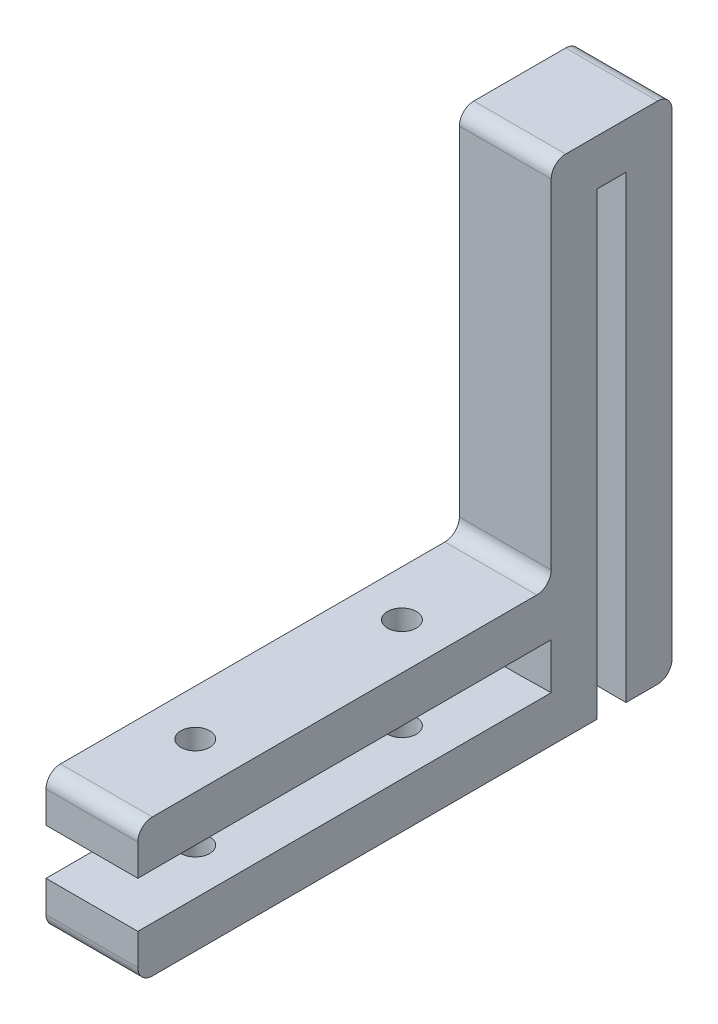
ISO-10303-21;
HEADER;
FILE_DESCRIPTION(('STEP AP214'),'2;1');
FILE_NAME('part.step','',(''),(''),'','','');
FILE_SCHEMA(('AUTOMOTIVE_DESIGN { 1 0 10303 214 1 1 1 1 }'));
ENDSEC;
DATA;
#1=APPLICATION_CONTEXT('core data for automotive mechanical design processes');
#2=APPLICATION_PROTOCOL_DEFINITION('international standard','automotive_design',2000,#1);
#3=PRODUCT_CONTEXT('',#1,'mechanical');
#4=PRODUCT('Part','Part','',(#3));
#5=PRODUCT_RELATED_PRODUCT_CATEGORY('part','',(#4));
#6=PRODUCT_DEFINITION_FORMATION('','',#4);
#7=PRODUCT_DEFINITION_CONTEXT('part definition',#1,'design');
#8=PRODUCT_DEFINITION('design','',#6,#7);
#9=PRODUCT_DEFINITION_SHAPE('','',#8);
#10=(LENGTH_UNIT() NAMED_UNIT(*) SI_UNIT(.MILLI.,.METRE.));
#11=(NAMED_UNIT(*) PLANE_ANGLE_UNIT() SI_UNIT($,.RADIAN.));
#12=(NAMED_UNIT(*) SI_UNIT($,.STERADIAN.) SOLID_ANGLE_UNIT());
#13=UNCERTAINTY_MEASURE_WITH_UNIT(LENGTH_MEASURE(1.E-05),#10,'distance_accuracy_value','');
#14=(GEOMETRIC_REPRESENTATION_CONTEXT(3) GLOBAL_UNCERTAINTY_ASSIGNED_CONTEXT((#13)) GLOBAL_UNIT_ASSIGNED_CONTEXT((#10,
#11,#12)) REPRESENTATION_CONTEXT('',''));
#15=CARTESIAN_POINT('',(0.,0.,0.));
#16=DIRECTION('',(0.,0.,1.));
#17=DIRECTION('',(1.,0.,0.));
#18=AXIS2_PLACEMENT_3D('',#15,#16,#17);
#19=CARTESIAN_POINT('',(0.,6.35,0.));
#20=DIRECTION('',(0.,-1.,0.));
#21=DIRECTION('',(0.,0.,-1.));
#22=AXIS2_PLACEMENT_3D('',#19,#20,#21);
#23=PLANE('',#22);
#24=CARTESIAN_POINT('',(6.35,6.35,-42.8625));
#25=DIRECTION('',(0.,-1.,0.));
#26=DIRECTION('',(0.,0.,-1.));
#27=AXIS2_PLACEMENT_3D('',#24,#25,#26);
#28=CIRCLE('',#27,2.);
#29=CARTESIAN_POINT('',(6.35,6.35,-44.8625));
#30=VERTEX_POINT('',#29);
#31=EDGE_CURVE('E214',#30,#30,#28,.T.);
#32=ORIENTED_EDGE('',*,*,#31,.T.);
#33=EDGE_LOOP('',(#32));
#34=FACE_BOUND('',#33,.T.);
#35=CARTESIAN_POINT('',(6.35,6.35,-14.2875));
#36=DIRECTION('',(0.,-1.,0.));
#37=DIRECTION('',(0.,0.,-1.));
#38=AXIS2_PLACEMENT_3D('',#35,#36,#37);
#39=CIRCLE('',#38,2.);
#40=CARTESIAN_POINT('',(6.35,6.35,-16.2875));
#41=VERTEX_POINT('',#40);
#42=EDGE_CURVE('E736',#41,#41,#39,.T.);
#43=ORIENTED_EDGE('',*,*,#42,.T.);
#44=EDGE_LOOP('',(#43));
#45=FACE_BOUND('',#44,.T.);
#46=CARTESIAN_POINT('',(6.35,6.35,-279.309267193606));
#47=DIRECTION('',(0.,1.,0.));
#48=DIRECTION('',(0.,0.,-1.));
#49=AXIS2_PLACEMENT_3D('',#46,#47,#48);
#50=CIRCLE('',#49,222.25);
#51=CARTESIAN_POINT('',(0.,6.35,-57.15));
#52=VERTEX_POINT('',#51);
#53=CARTESIAN_POINT('',(12.7,6.35,-57.15));
#54=VERTEX_POINT('',#53);
#55=EDGE_CURVE('E207',#52,#54,#50,.T.);
#56=ORIENTED_EDGE('',*,*,#55,.F.);
#57=DIRECTION('',(0.,0.,1.));
#58=VECTOR('',#57,1.);
#59=CARTESIAN_POINT('',(0.,6.35,0.));
#60=LINE('',#59,#58);
#61=CARTESIAN_POINT('',(0.,6.35,0.));
#62=VERTEX_POINT('',#61);
#63=EDGE_CURVE('E195',#52,#62,#60,.T.);
#64=ORIENTED_EDGE('',*,*,#63,.T.);
#65=DIRECTION('',(1.,0.,0.));
#66=VECTOR('',#65,1.);
#67=CARTESIAN_POINT('',(0.,6.35,0.));
#68=LINE('',#67,#66);
#69=CARTESIAN_POINT('',(12.7,6.35,0.));
#70=VERTEX_POINT('',#69);
#71=EDGE_CURVE('E291',#62,#70,#68,.T.);
#72=ORIENTED_EDGE('',*,*,#71,.T.);
#73=DIRECTION('',(0.,0.,-1.));
#74=VECTOR('',#73,1.);
#75=CARTESIAN_POINT('',(12.7,6.35,0.));
#76=LINE('',#75,#74);
#77=EDGE_CURVE('E295',#70,#54,#76,.T.);
#78=ORIENTED_EDGE('',*,*,#77,.T.);
#79=EDGE_LOOP('',(#56,#64,#72,#78));
#80=FACE_BOUND('',#79,.T.);
#81=ADVANCED_FACE('F38',(#34,#45,#80),#23,.F.);
#82=CARTESIAN_POINT('',(0.,12.7,0.));
#83=DIRECTION('',(0.,1.,0.));
#84=DIRECTION('',(0.,0.,1.));
#85=AXIS2_PLACEMENT_3D('',#82,#83,#84);
#86=PLANE('',#85);
#87=CARTESIAN_POINT('',(6.35,12.7,-42.8625));
#88=DIRECTION('',(0.,1.,0.));
#89=DIRECTION('',(0.,0.,1.));
#90=AXIS2_PLACEMENT_3D('',#87,#88,#89);
#91=CIRCLE('',#90,2.);
#92=CARTESIAN_POINT('',(6.35,12.7,-40.8625));
#93=VERTEX_POINT('',#92);
#94=EDGE_CURVE('E733',#93,#93,#91,.T.);
#95=ORIENTED_EDGE('',*,*,#94,.T.);
#96=EDGE_LOOP('',(#95));
#97=FACE_BOUND('',#96,.T.);
#98=CARTESIAN_POINT('',(6.35,12.7,-14.2875));
#99=DIRECTION('',(0.,1.,0.));
#100=DIRECTION('',(0.,0.,1.));
#101=AXIS2_PLACEMENT_3D('',#98,#99,#100);
#102=CIRCLE('',#101,2.);
#103=CARTESIAN_POINT('',(6.35,12.7,-12.2875));
#104=VERTEX_POINT('',#103);
#105=EDGE_CURVE('E740',#104,#104,#102,.T.);
#106=ORIENTED_EDGE('',*,*,#105,.T.);
#107=EDGE_LOOP('',(#106));
#108=FACE_BOUND('',#107,.T.);
#109=CARTESIAN_POINT('',(6.35,12.7,-279.309267193606));
#110=DIRECTION('',(0.,1.,0.));
#111=DIRECTION('',(0.,0.,-1.));
#112=AXIS2_PLACEMENT_3D('',#109,#110,#111);
#113=CIRCLE('',#112,222.25);
#114=CARTESIAN_POINT('',(0.,12.7,-57.15));
#115=VERTEX_POINT('',#114);
#116=CARTESIAN_POINT('',(12.7,12.7,-57.15));
#117=VERTEX_POINT('',#116);
#118=EDGE_CURVE('E180',#115,#117,#113,.T.);
#119=ORIENTED_EDGE('',*,*,#118,.T.);
#120=DIRECTION('',(0.,0.,-1.));
#121=VECTOR('',#120,1.);
#122=CARTESIAN_POINT('',(12.7,12.7,-63.5));
#123=LINE('',#122,#121);
#124=CARTESIAN_POINT('',(12.7,12.7,0.));
#125=VERTEX_POINT('',#124);
#126=EDGE_CURVE('E274',#125,#117,#123,.T.);
#127=ORIENTED_EDGE('',*,*,#126,.F.);
#128=DIRECTION('',(1.,0.,0.));
#129=VECTOR('',#128,1.);
#130=CARTESIAN_POINT('',(0.,12.7,0.));
#131=LINE('',#130,#129);
#132=CARTESIAN_POINT('',(0.,12.7,0.));
#133=VERTEX_POINT('',#132);
#134=EDGE_CURVE('E183',#133,#125,#131,.T.);
#135=ORIENTED_EDGE('',*,*,#134,.F.);
#136=DIRECTION('',(0.,0.,1.));
#137=VECTOR('',#136,1.);
#138=CARTESIAN_POINT('',(0.,12.7,-63.5));
#139=LINE('',#138,#137);
#140=EDGE_CURVE('E175',#115,#133,#139,.T.);
#141=ORIENTED_EDGE('',*,*,#140,.F.);
#142=EDGE_LOOP('',(#119,#127,#135,#141));
#143=FACE_BOUND('',#142,.T.);
#144=ADVANCED_FACE('F177',(#97,#108,#143),#86,.F.);
#145=CARTESIAN_POINT('',(0.,6.35,-63.5));
#146=DIRECTION('',(0.,0.,1.));
#147=DIRECTION('',(1.,0.,0.));
#148=AXIS2_PLACEMENT_3D('',#145,#146,#147);
#149=PLANE('',#148);
#150=DIRECTION('',(-1.,0.,0.));
#151=VECTOR('',#150,1.);
#152=CARTESIAN_POINT('',(12.7,63.5,-63.5));
#153=LINE('',#152,#151);
#154=CARTESIAN_POINT('',(12.7,63.5,-63.5));
#155=VERTEX_POINT('',#154);
#156=CARTESIAN_POINT('',(0.,63.5,-63.5));
#157=VERTEX_POINT('',#156);
#158=EDGE_CURVE('E240',#155,#157,#153,.T.);
#159=ORIENTED_EDGE('',*,*,#158,.F.);
#160=DIRECTION('',(0.,-1.,0.));
#161=VECTOR('',#160,1.);
#162=CARTESIAN_POINT('',(12.7,6.35,-63.5));
#163=LINE('',#162,#161);
#164=CARTESIAN_POINT('',(12.7,0.,-63.5));
#165=VERTEX_POINT('',#164);
#166=EDGE_CURVE('E309',#155,#165,#163,.T.);
#167=ORIENTED_EDGE('',*,*,#166,.T.);
#168=DIRECTION('',(-1.,0.,0.));
#169=VECTOR('',#168,1.);
#170=CARTESIAN_POINT('',(0.,0.,-63.5));
#171=LINE('',#170,#169);
#172=CARTESIAN_POINT('',(0.,0.,-63.5));
#173=VERTEX_POINT('',#172);
#174=EDGE_CURVE('E292',#165,#173,#171,.T.);
#175=ORIENTED_EDGE('',*,*,#174,.T.);
#176=DIRECTION('',(0.,-1.,0.));
#177=VECTOR('',#176,1.);
#178=CARTESIAN_POINT('',(0.,6.35,-63.5));
#179=LINE('',#178,#177);
#180=EDGE_CURVE('E298',#157,#173,#179,.T.);
#181=ORIENTED_EDGE('',*,*,#180,.F.);
#182=EDGE_LOOP('',(#159,#167,#175,#181));
#183=FACE_BOUND('',#182,.T.);
#184=ADVANCED_FACE('F438',(#183),#149,.F.);
#185=CARTESIAN_POINT('',(0.,6.35,0.));
#186=DIRECTION('',(1.,0.,0.));
#187=DIRECTION('',(0.,0.,-1.));
#188=AXIS2_PLACEMENT_3D('',#185,#186,#187);
#189=PLANE('',#188);
#190=DIRECTION('',(0.,0.,1.));
#191=VECTOR('',#190,1.);
#192=CARTESIAN_POINT('',(0.,0.,0.));
#193=LINE('',#192,#191);
#194=CARTESIAN_POINT('',(0.,0.,-2.));
#195=VERTEX_POINT('',#194);
#196=EDGE_CURVE('E199',#173,#195,#193,.T.);
#197=ORIENTED_EDGE('',*,*,#196,.T.);
#198=CARTESIAN_POINT('',(0.,2.,-2.));
#199=DIRECTION('',(1.,0.,0.));
#200=DIRECTION('',(0.,0.,-1.));
#201=AXIS2_PLACEMENT_3D('',#198,#199,#200);
#202=CIRCLE('',#201,2.);
#203=CARTESIAN_POINT('',(0.,2.,0.));
#204=VERTEX_POINT('',#203);
#205=EDGE_CURVE('E356',#195,#204,#202,.F.);
#206=ORIENTED_EDGE('',*,*,#205,.T.);
#207=DIRECTION('',(0.,-1.,0.));
#208=VECTOR('',#207,1.);
#209=CARTESIAN_POINT('',(0.,6.35,0.));
#210=LINE('',#209,#208);
#211=EDGE_CURVE('E317',#62,#204,#210,.T.);
#212=ORIENTED_EDGE('',*,*,#211,.F.);
#213=ORIENTED_EDGE('',*,*,#63,.F.);
#214=DIRECTION('',(0.,-1.,0.));
#215=VECTOR('',#214,1.);
#216=CARTESIAN_POINT('',(0.,12.7,-57.15));
#217=LINE('',#216,#215);
#218=EDGE_CURVE('E191',#115,#52,#217,.T.);
#219=ORIENTED_EDGE('',*,*,#218,.F.);
#220=ORIENTED_EDGE('',*,*,#140,.T.);
#221=DIRECTION('',(0.,-1.,0.));
#222=VECTOR('',#221,1.);
#223=CARTESIAN_POINT('',(0.,19.05,0.));
#224=LINE('',#223,#222);
#225=CARTESIAN_POINT('',(0.,17.05,0.));
#226=VERTEX_POINT('',#225);
#227=EDGE_CURVE('E284',#226,#133,#224,.T.);
#228=ORIENTED_EDGE('',*,*,#227,.F.);
#229=CARTESIAN_POINT('',(0.,17.05,-2.));
#230=DIRECTION('',(1.,0.,0.));
#231=DIRECTION('',(0.,0.,-1.));
#232=AXIS2_PLACEMENT_3D('',#229,#230,#231);
#233=CIRCLE('',#232,2.);
#234=CARTESIAN_POINT('',(0.,19.05,-2.));
#235=VERTEX_POINT('',#234);
#236=EDGE_CURVE('E352',#226,#235,#233,.F.);
#237=ORIENTED_EDGE('',*,*,#236,.T.);
#238=DIRECTION('',(0.,0.,1.));
#239=VECTOR('',#238,1.);
#240=CARTESIAN_POINT('',(0.,19.05,-63.5));
#241=LINE('',#240,#239);
#242=CARTESIAN_POINT('',(0.,19.05,-55.15));
#243=VERTEX_POINT('',#242);
#244=EDGE_CURVE('E270',#243,#235,#241,.T.);
#245=ORIENTED_EDGE('',*,*,#244,.F.);
#246=CARTESIAN_POINT('',(0.,21.05,-55.15));
#247=DIRECTION('',(1.,0.,0.));
#248=DIRECTION('',(0.,0.,-1.));
#249=AXIS2_PLACEMENT_3D('',#246,#247,#248);
#250=CIRCLE('',#249,2.);
#251=CARTESIAN_POINT('',(0.,21.05,-57.15));
#252=VERTEX_POINT('',#251);
#253=EDGE_CURVE('E11',#243,#252,#250,.T.);
#254=ORIENTED_EDGE('',*,*,#253,.T.);
#255=DIRECTION('',(0.,-1.,0.));
#256=VECTOR('',#255,1.);
#257=CARTESIAN_POINT('',(0.,69.85,-57.15));
#258=LINE('',#257,#256);
#259=CARTESIAN_POINT('',(0.,67.85,-57.15));
#260=VERTEX_POINT('',#259);
#261=EDGE_CURVE('E187',#260,#252,#258,.T.);
#262=ORIENTED_EDGE('',*,*,#261,.F.);
#263=CARTESIAN_POINT('',(0.,67.85,-59.15));
#264=DIRECTION('',(1.,0.,0.));
#265=DIRECTION('',(0.,0.,-1.));
#266=AXIS2_PLACEMENT_3D('',#263,#264,#265);
#267=CIRCLE('',#266,2.);
#268=CARTESIAN_POINT('',(0.,69.85,-59.15));
#269=VERTEX_POINT('',#268);
#270=EDGE_CURVE('E343',#260,#269,#267,.F.);
#271=ORIENTED_EDGE('',*,*,#270,.T.);
#272=DIRECTION('',(0.,0.,1.));
#273=VECTOR('',#272,1.);
#274=CARTESIAN_POINT('',(0.,69.85,-63.5));
#275=LINE('',#274,#273);
#276=CARTESIAN_POINT('',(0.,69.85,-71.85));
#277=VERTEX_POINT('',#276);
#278=EDGE_CURVE('E256',#277,#269,#275,.T.);
#279=ORIENTED_EDGE('',*,*,#278,.F.);
#280=CARTESIAN_POINT('',(0.,67.85,-71.85));
#281=DIRECTION('',(1.,0.,0.));
#282=DIRECTION('',(0.,0.,-1.));
#283=AXIS2_PLACEMENT_3D('',#280,#281,#282);
#284=CIRCLE('',#283,2.);
#285=CARTESIAN_POINT('',(0.,67.85,-73.85));
#286=VERTEX_POINT('',#285);
#287=EDGE_CURVE('E346',#277,#286,#284,.F.);
#288=ORIENTED_EDGE('',*,*,#287,.T.);
#289=DIRECTION('',(0.,1.,0.));
#290=VECTOR('',#289,1.);
#291=CARTESIAN_POINT('',(0.,69.85,-73.85));
#292=LINE('',#291,#290);
#293=CARTESIAN_POINT('',(0.,2.,-73.85));
#294=VERTEX_POINT('',#293);
#295=EDGE_CURVE('E223',#294,#286,#292,.T.);
#296=ORIENTED_EDGE('',*,*,#295,.F.);
#297=CARTESIAN_POINT('',(0.,2.,-71.85));
#298=DIRECTION('',(1.,0.,0.));
#299=DIRECTION('',(0.,0.,-1.));
#300=AXIS2_PLACEMENT_3D('',#297,#298,#299);
#301=CIRCLE('',#300,2.);
#302=CARTESIAN_POINT('',(0.,0.,-71.85));
#303=VERTEX_POINT('',#302);
#304=EDGE_CURVE('E349',#294,#303,#301,.F.);
#305=ORIENTED_EDGE('',*,*,#304,.T.);
#306=DIRECTION('',(0.,0.,1.));
#307=VECTOR('',#306,1.);
#308=CARTESIAN_POINT('',(0.,0.,-73.85));
#309=LINE('',#308,#307);
#310=CARTESIAN_POINT('',(0.,0.,-67.5));
#311=VERTEX_POINT('',#310);
#312=EDGE_CURVE('E227',#303,#311,#309,.T.);
#313=ORIENTED_EDGE('',*,*,#312,.T.);
#314=DIRECTION('',(0.,1.,0.));
#315=VECTOR('',#314,1.);
#316=CARTESIAN_POINT('',(0.,69.85,-67.5));
#317=LINE('',#316,#315);
#318=CARTESIAN_POINT('',(0.,63.5,-67.5));
#319=VERTEX_POINT('',#318);
#320=EDGE_CURVE('E224',#311,#319,#317,.T.);
#321=ORIENTED_EDGE('',*,*,#320,.T.);
#322=DIRECTION('',(0.,0.,1.));
#323=VECTOR('',#322,1.);
#324=CARTESIAN_POINT('',(0.,63.5,-67.5));
#325=LINE('',#324,#323);
#326=EDGE_CURVE('E245',#319,#157,#325,.T.);
#327=ORIENTED_EDGE('',*,*,#326,.T.);
#328=ORIENTED_EDGE('',*,*,#180,.T.);
#329=EDGE_LOOP('',(#197,#206,#212,#213,#219,#220,#228,#237,#245,#254,#262,#271,#279,#288,#296,
#305,#313,#321,#327,#328));
#330=FACE_BOUND('',#329,.T.);
#331=ADVANCED_FACE('F193',(#330),#189,.F.);
#332=CARTESIAN_POINT('',(0.,6.35,0.));
#333=DIRECTION('',(0.,0.,-1.));
#334=DIRECTION('',(-1.,0.,0.));
#335=AXIS2_PLACEMENT_3D('',#332,#333,#334);
#336=PLANE('',#335);
#337=ORIENTED_EDGE('',*,*,#211,.T.);
#338=DIRECTION('',(1.,0.,0.));
#339=VECTOR('',#338,1.);
#340=CARTESIAN_POINT('',(12.7,2.,0.));
#341=LINE('',#340,#339);
#342=CARTESIAN_POINT('',(12.7,2.,0.));
#343=VERTEX_POINT('',#342);
#344=EDGE_CURVE('E321',#204,#343,#341,.T.);
#345=ORIENTED_EDGE('',*,*,#344,.T.);
#346=DIRECTION('',(0.,-1.,0.));
#347=VECTOR('',#346,1.);
#348=CARTESIAN_POINT('',(12.7,6.35,0.));
#349=LINE('',#348,#347);
#350=EDGE_CURVE('E313',#70,#343,#349,.T.);
#351=ORIENTED_EDGE('',*,*,#350,.F.);
#352=ORIENTED_EDGE('',*,*,#71,.F.);
#353=EDGE_LOOP('',(#337,#345,#351,#352));
#354=FACE_BOUND('',#353,.T.);
#355=ADVANCED_FACE('F451',(#354),#336,.F.);
#356=CARTESIAN_POINT('',(12.7,6.35,0.));
#357=DIRECTION('',(-1.,0.,0.));
#358=DIRECTION('',(0.,0.,1.));
#359=AXIS2_PLACEMENT_3D('',#356,#357,#358);
#360=PLANE('',#359);
#361=ORIENTED_EDGE('',*,*,#350,.T.);
#362=CARTESIAN_POINT('',(12.7,2.,-2.));
#363=DIRECTION('',(-1.,0.,0.));
#364=DIRECTION('',(0.,0.,1.));
#365=AXIS2_PLACEMENT_3D('',#362,#363,#364);
#366=CIRCLE('',#365,2.);
#367=CARTESIAN_POINT('',(12.7,0.,-2.));
#368=VERTEX_POINT('',#367);
#369=EDGE_CURVE('E337',#343,#368,#366,.F.);
#370=ORIENTED_EDGE('',*,*,#369,.T.);
#371=DIRECTION('',(0.,0.,-1.));
#372=VECTOR('',#371,1.);
#373=CARTESIAN_POINT('',(12.7,0.,0.));
#374=LINE('',#373,#372);
#375=EDGE_CURVE('E301',#368,#165,#374,.T.);
#376=ORIENTED_EDGE('',*,*,#375,.T.);
#377=ORIENTED_EDGE('',*,*,#166,.F.);
#378=DIRECTION('',(0.,0.,1.));
#379=VECTOR('',#378,1.);
#380=CARTESIAN_POINT('',(12.7,63.5,-67.5));
#381=LINE('',#380,#379);
#382=CARTESIAN_POINT('',(12.7,63.5,-67.5));
#383=VERTEX_POINT('',#382);
#384=EDGE_CURVE('E252',#383,#155,#381,.T.);
#385=ORIENTED_EDGE('',*,*,#384,.F.);
#386=DIRECTION('',(0.,-1.,0.));
#387=VECTOR('',#386,1.);
#388=CARTESIAN_POINT('',(12.7,69.85,-67.5));
#389=LINE('',#388,#387);
#390=CARTESIAN_POINT('',(12.7,0.,-67.5));
#391=VERTEX_POINT('',#390);
#392=EDGE_CURVE('E206',#383,#391,#389,.T.);
#393=ORIENTED_EDGE('',*,*,#392,.T.);
#394=DIRECTION('',(0.,0.,1.));
#395=VECTOR('',#394,1.);
#396=CARTESIAN_POINT('',(12.7,0.,-73.85));
#397=LINE('',#396,#395);
#398=CARTESIAN_POINT('',(12.7,0.,-71.85));
#399=VERTEX_POINT('',#398);
#400=EDGE_CURVE('E237',#399,#391,#397,.T.);
#401=ORIENTED_EDGE('',*,*,#400,.F.);
#402=CARTESIAN_POINT('',(12.7,2.,-71.85));
#403=DIRECTION('',(-1.,0.,0.));
#404=DIRECTION('',(0.,0.,1.));
#405=AXIS2_PLACEMENT_3D('',#402,#403,#404);
#406=CIRCLE('',#405,2.);
#407=CARTESIAN_POINT('',(12.7,2.,-73.85));
#408=VERTEX_POINT('',#407);
#409=EDGE_CURVE('E331',#399,#408,#406,.F.);
#410=ORIENTED_EDGE('',*,*,#409,.T.);
#411=DIRECTION('',(0.,-1.,0.));
#412=VECTOR('',#411,1.);
#413=CARTESIAN_POINT('',(12.7,69.85,-73.85));
#414=LINE('',#413,#412);
#415=CARTESIAN_POINT('',(12.7,67.85,-73.85));
#416=VERTEX_POINT('',#415);
#417=EDGE_CURVE('E219',#416,#408,#414,.T.);
#418=ORIENTED_EDGE('',*,*,#417,.F.);
#419=CARTESIAN_POINT('',(12.7,67.85,-71.85));
#420=DIRECTION('',(-1.,0.,0.));
#421=DIRECTION('',(0.,0.,1.));
#422=AXIS2_PLACEMENT_3D('',#419,#420,#421);
#423=CIRCLE('',#422,2.);
#424=CARTESIAN_POINT('',(12.7,69.85,-71.85));
#425=VERTEX_POINT('',#424);
#426=EDGE_CURVE('E328',#416,#425,#423,.F.);
#427=ORIENTED_EDGE('',*,*,#426,.T.);
#428=DIRECTION('',(0.,0.,-1.));
#429=VECTOR('',#428,1.);
#430=CARTESIAN_POINT('',(12.7,69.85,-63.5));
#431=LINE('',#430,#429);
#432=CARTESIAN_POINT('',(12.7,69.85,-59.15));
#433=VERTEX_POINT('',#432);
#434=EDGE_CURVE('E260',#433,#425,#431,.T.);
#435=ORIENTED_EDGE('',*,*,#434,.F.);
#436=CARTESIAN_POINT('',(12.7,67.85,-59.15));
#437=DIRECTION('',(-1.,0.,0.));
#438=DIRECTION('',(0.,0.,1.));
#439=AXIS2_PLACEMENT_3D('',#436,#437,#438);
#440=CIRCLE('',#439,2.);
#441=CARTESIAN_POINT('',(12.7,67.85,-57.15));
#442=VERTEX_POINT('',#441);
#443=EDGE_CURVE('E325',#433,#442,#440,.F.);
#444=ORIENTED_EDGE('',*,*,#443,.T.);
#445=DIRECTION('',(0.,-1.,0.));
#446=VECTOR('',#445,1.);
#447=CARTESIAN_POINT('',(12.7,69.85,-57.15));
#448=LINE('',#447,#446);
#449=CARTESIAN_POINT('',(12.7,21.05,-57.15));
#450=VERTEX_POINT('',#449);
#451=EDGE_CURVE('E264',#442,#450,#448,.T.);
#452=ORIENTED_EDGE('',*,*,#451,.T.);
#453=CARTESIAN_POINT('',(12.7,21.05,-55.15));
#454=DIRECTION('',(-1.,0.,0.));
#455=DIRECTION('',(0.,0.,1.));
#456=AXIS2_PLACEMENT_3D('',#453,#454,#455);
#457=CIRCLE('',#456,2.);
#458=CARTESIAN_POINT('',(12.7,19.05,-55.15));
#459=VERTEX_POINT('',#458);
#460=EDGE_CURVE('E47',#450,#459,#457,.T.);
#461=ORIENTED_EDGE('',*,*,#460,.T.);
#462=DIRECTION('',(0.,0.,-1.));
#463=VECTOR('',#462,1.);
#464=CARTESIAN_POINT('',(12.7,19.05,-63.5));
#465=LINE('',#464,#463);
#466=CARTESIAN_POINT('',(12.7,19.05,-2.));
#467=VERTEX_POINT('',#466);
#468=EDGE_CURVE('E273',#467,#459,#465,.T.);
#469=ORIENTED_EDGE('',*,*,#468,.F.);
#470=CARTESIAN_POINT('',(12.7,17.05,-2.));
#471=DIRECTION('',(-1.,0.,0.));
#472=DIRECTION('',(0.,0.,1.));
#473=AXIS2_PLACEMENT_3D('',#470,#471,#472);
#474=CIRCLE('',#473,2.);
#475=CARTESIAN_POINT('',(12.7,17.05,0.));
#476=VERTEX_POINT('',#475);
#477=EDGE_CURVE('E334',#467,#476,#474,.F.);
#478=ORIENTED_EDGE('',*,*,#477,.T.);
#479=DIRECTION('',(0.,-1.,0.));
#480=VECTOR('',#479,1.);
#481=CARTESIAN_POINT('',(12.7,19.05,0.));
#482=LINE('',#481,#480);
#483=EDGE_CURVE('E276',#476,#125,#482,.T.);
#484=ORIENTED_EDGE('',*,*,#483,.T.);
#485=ORIENTED_EDGE('',*,*,#126,.T.);
#486=DIRECTION('',(0.,-1.,0.));
#487=VECTOR('',#486,1.);
#488=CARTESIAN_POINT('',(12.7,12.7,-57.15));
#489=LINE('',#488,#487);
#490=EDGE_CURVE('E200',#117,#54,#489,.T.);
#491=ORIENTED_EDGE('',*,*,#490,.T.);
#492=ORIENTED_EDGE('',*,*,#77,.F.);
#493=EDGE_LOOP('',(#361,#370,#376,#377,#385,#393,#401,#410,#418,#427,#435,#444,#452,#461,#469,
#478,#484,#485,#491,#492));
#494=FACE_BOUND('',#493,.T.);
#495=ADVANCED_FACE('F401',(#494),#360,.F.);
#496=CARTESIAN_POINT('',(0.,0.,0.));
#497=DIRECTION('',(0.,-1.,0.));
#498=DIRECTION('',(0.,0.,-1.));
#499=AXIS2_PLACEMENT_3D('',#496,#497,#498);
#500=PLANE('',#499);
#501=CARTESIAN_POINT('',(6.35,0.,-42.8625));
#502=DIRECTION('',(0.,1.,0.));
#503=DIRECTION('',(0.,0.,1.));
#504=AXIS2_PLACEMENT_3D('',#501,#502,#503);
#505=CIRCLE('',#504,2.);
#506=CARTESIAN_POINT('',(6.35,0.,-40.8625));
#507=VERTEX_POINT('',#506);
#508=EDGE_CURVE('E730',#507,#507,#505,.T.);
#509=ORIENTED_EDGE('',*,*,#508,.T.);
#510=EDGE_LOOP('',(#509));
#511=FACE_BOUND('',#510,.T.);
#512=CARTESIAN_POINT('',(6.35,0.,-14.2875));
#513=DIRECTION('',(0.,1.,0.));
#514=DIRECTION('',(0.,0.,-1.));
#515=AXIS2_PLACEMENT_3D('',#512,#513,#514);
#516=CIRCLE('',#515,2.);
#517=CARTESIAN_POINT('',(6.35,0.,-16.2875));
#518=VERTEX_POINT('',#517);
#519=EDGE_CURVE('E750',#518,#518,#516,.T.);
#520=ORIENTED_EDGE('',*,*,#519,.T.);
#521=EDGE_LOOP('',(#520));
#522=FACE_BOUND('',#521,.T.);
#523=ORIENTED_EDGE('',*,*,#375,.F.);
#524=DIRECTION('',(1.,0.,0.));
#525=VECTOR('',#524,1.);
#526=CARTESIAN_POINT('',(0.,0.,-2.));
#527=LINE('',#526,#525);
#528=EDGE_CURVE('E340',#368,#195,#527,.F.);
#529=ORIENTED_EDGE('',*,*,#528,.T.);
#530=ORIENTED_EDGE('',*,*,#196,.F.);
#531=ORIENTED_EDGE('',*,*,#174,.F.);
#532=EDGE_LOOP('',(#523,#529,#530,#531));
#533=FACE_BOUND('',#532,.T.);
#534=ADVANCED_FACE('F443',(#511,#522,#533),#500,.T.);
#535=CARTESIAN_POINT('',(0.,19.05,0.));
#536=DIRECTION('',(0.,0.,-1.));
#537=DIRECTION('',(-1.,0.,0.));
#538=AXIS2_PLACEMENT_3D('',#535,#536,#537);
#539=PLANE('',#538);
#540=ORIENTED_EDGE('',*,*,#483,.F.);
#541=DIRECTION('',(1.,0.,0.));
#542=VECTOR('',#541,1.);
#543=CARTESIAN_POINT('',(0.,17.05,0.));
#544=LINE('',#543,#542);
#545=EDGE_CURVE('E363',#476,#226,#544,.F.);
#546=ORIENTED_EDGE('',*,*,#545,.T.);
#547=ORIENTED_EDGE('',*,*,#227,.T.);
#548=ORIENTED_EDGE('',*,*,#134,.T.);
#549=EDGE_LOOP('',(#540,#546,#547,#548));
#550=FACE_BOUND('',#549,.T.);
#551=ADVANCED_FACE('F458',(#550),#539,.F.);
#552=CARTESIAN_POINT('',(0.,19.05,0.));
#553=DIRECTION('',(0.,1.,0.));
#554=DIRECTION('',(0.,0.,1.));
#555=AXIS2_PLACEMENT_3D('',#552,#553,#554);
#556=PLANE('',#555);
#557=CARTESIAN_POINT('',(6.35,19.05,-42.8625));
#558=DIRECTION('',(0.,1.,0.));
#559=DIRECTION('',(0.,0.,1.));
#560=AXIS2_PLACEMENT_3D('',#557,#558,#559);
#561=CIRCLE('',#560,2.);
#562=CARTESIAN_POINT('',(6.35,19.05,-40.8625));
#563=VERTEX_POINT('',#562);
#564=EDGE_CURVE('E754',#563,#563,#561,.T.);
#565=ORIENTED_EDGE('',*,*,#564,.F.);
#566=EDGE_LOOP('',(#565));
#567=FACE_BOUND('',#566,.T.);
#568=CARTESIAN_POINT('',(6.35,19.05,-14.2875));
#569=DIRECTION('',(0.,1.,0.));
#570=DIRECTION('',(0.,0.,-1.));
#571=AXIS2_PLACEMENT_3D('',#568,#569,#570);
#572=CIRCLE('',#571,2.);
#573=CARTESIAN_POINT('',(6.35,19.05,-16.2875));
#574=VERTEX_POINT('',#573);
#575=EDGE_CURVE('E746',#574,#574,#572,.T.);
#576=ORIENTED_EDGE('',*,*,#575,.F.);
#577=EDGE_LOOP('',(#576));
#578=FACE_BOUND('',#577,.T.);
#579=ORIENTED_EDGE('',*,*,#468,.T.);
#580=DIRECTION('',(1.,0.,0.));
#581=VECTOR('',#580,1.);
#582=CARTESIAN_POINT('',(0.,19.05,-55.15));
#583=LINE('',#582,#581);
#584=EDGE_CURVE('E60',#459,#243,#583,.F.);
#585=ORIENTED_EDGE('',*,*,#584,.T.);
#586=ORIENTED_EDGE('',*,*,#244,.T.);
#587=DIRECTION('',(1.,0.,0.));
#588=VECTOR('',#587,1.);
#589=CARTESIAN_POINT('',(12.7,19.05,-2.));
#590=LINE('',#589,#588);
#591=EDGE_CURVE('E359',#235,#467,#590,.T.);
#592=ORIENTED_EDGE('',*,*,#591,.T.);
#593=EDGE_LOOP('',(#579,#585,#586,#592));
#594=FACE_BOUND('',#593,.T.);
#595=ADVANCED_FACE('F463',(#567,#578,#594),#556,.T.);
#596=CARTESIAN_POINT('',(0.,69.85,-57.15));
#597=DIRECTION('',(0.,0.,-1.));
#598=DIRECTION('',(-1.,0.,0.));
#599=AXIS2_PLACEMENT_3D('',#596,#597,#598);
#600=PLANE('',#599);
#601=ORIENTED_EDGE('',*,*,#261,.T.);
#602=DIRECTION('',(1.,0.,0.));
#603=VECTOR('',#602,1.);
#604=CARTESIAN_POINT('',(0.,21.05,-57.15));
#605=LINE('',#604,#603);
#606=EDGE_CURVE('E387',#252,#450,#605,.T.);
#607=ORIENTED_EDGE('',*,*,#606,.T.);
#608=ORIENTED_EDGE('',*,*,#451,.F.);
#609=DIRECTION('',(1.,0.,0.));
#610=VECTOR('',#609,1.);
#611=CARTESIAN_POINT('',(0.,67.85,-57.15));
#612=LINE('',#611,#610);
#613=EDGE_CURVE('E384',#442,#260,#612,.F.);
#614=ORIENTED_EDGE('',*,*,#613,.T.);
#615=EDGE_LOOP('',(#601,#607,#608,#614));
#616=FACE_BOUND('',#615,.T.);
#617=ADVANCED_FACE('F396',(#616),#600,.F.);
#618=CARTESIAN_POINT('',(0.,69.85,0.));
#619=DIRECTION('',(0.,1.,0.));
#620=DIRECTION('',(0.,0.,1.));
#621=AXIS2_PLACEMENT_3D('',#618,#619,#620);
#622=PLANE('',#621);
#623=ORIENTED_EDGE('',*,*,#434,.T.);
#624=DIRECTION('',(1.,0.,0.));
#625=VECTOR('',#624,1.);
#626=CARTESIAN_POINT('',(0.,69.85,-71.85));
#627=LINE('',#626,#625);
#628=EDGE_CURVE('E381',#425,#277,#627,.F.);
#629=ORIENTED_EDGE('',*,*,#628,.T.);
#630=ORIENTED_EDGE('',*,*,#278,.T.);
#631=DIRECTION('',(1.,0.,0.));
#632=VECTOR('',#631,1.);
#633=CARTESIAN_POINT('',(12.7,69.85,-59.15));
#634=LINE('',#633,#632);
#635=EDGE_CURVE('E377',#269,#433,#634,.T.);
#636=ORIENTED_EDGE('',*,*,#635,.T.);
#637=EDGE_LOOP('',(#623,#629,#630,#636));
#638=FACE_BOUND('',#637,.T.);
#639=ADVANCED_FACE('F408',(#638),#622,.T.);
#640=CARTESIAN_POINT('',(12.7,63.5,-67.5));
#641=DIRECTION('',(0.,1.,0.));
#642=DIRECTION('',(0.,0.,1.));
#643=AXIS2_PLACEMENT_3D('',#640,#641,#642);
#644=PLANE('',#643);
#645=ORIENTED_EDGE('',*,*,#158,.T.);
#646=ORIENTED_EDGE('',*,*,#326,.F.);
#647=DIRECTION('',(-1.,0.,0.));
#648=VECTOR('',#647,1.);
#649=CARTESIAN_POINT('',(12.7,63.5,-67.5));
#650=LINE('',#649,#648);
#651=EDGE_CURVE('E241',#383,#319,#650,.T.);
#652=ORIENTED_EDGE('',*,*,#651,.F.);
#653=ORIENTED_EDGE('',*,*,#384,.T.);
#654=EDGE_LOOP('',(#645,#646,#652,#653));
#655=FACE_BOUND('',#654,.T.);
#656=ADVANCED_FACE('F434',(#655),#644,.F.);
#657=CARTESIAN_POINT('',(0.,0.,-67.5));
#658=DIRECTION('',(0.,0.,-1.));
#659=DIRECTION('',(-1.,0.,0.));
#660=AXIS2_PLACEMENT_3D('',#657,#658,#659);
#661=PLANE('',#660);
#662=ORIENTED_EDGE('',*,*,#392,.F.);
#663=ORIENTED_EDGE('',*,*,#651,.T.);
#664=ORIENTED_EDGE('',*,*,#320,.F.);
#665=DIRECTION('',(-1.,0.,0.));
#666=VECTOR('',#665,1.);
#667=CARTESIAN_POINT('',(12.7,0.,-67.5));
#668=LINE('',#667,#666);
#669=EDGE_CURVE('E212',#391,#311,#668,.T.);
#670=ORIENTED_EDGE('',*,*,#669,.F.);
#671=EDGE_LOOP('',(#662,#663,#664,#670));
#672=FACE_BOUND('',#671,.T.);
#673=ADVANCED_FACE('F432',(#672),#661,.F.);
#674=CARTESIAN_POINT('',(12.7,0.,-73.85));
#675=DIRECTION('',(0.,1.,0.));
#676=DIRECTION('',(0.,0.,1.));
#677=AXIS2_PLACEMENT_3D('',#674,#675,#676);
#678=PLANE('',#677);
#679=ORIENTED_EDGE('',*,*,#312,.F.);
#680=DIRECTION('',(-1.,0.,0.));
#681=VECTOR('',#680,1.);
#682=CARTESIAN_POINT('',(12.7,0.,-71.85));
#683=LINE('',#682,#681);
#684=EDGE_CURVE('E374',#303,#399,#683,.F.);
#685=ORIENTED_EDGE('',*,*,#684,.T.);
#686=ORIENTED_EDGE('',*,*,#400,.T.);
#687=ORIENTED_EDGE('',*,*,#669,.T.);
#688=EDGE_LOOP('',(#679,#685,#686,#687));
#689=FACE_BOUND('',#688,.T.);
#690=ADVANCED_FACE('F427',(#689),#678,.F.);
#691=CARTESIAN_POINT('',(0.,0.,-73.85));
#692=DIRECTION('',(0.,0.,-1.));
#693=DIRECTION('',(-1.,0.,0.));
#694=AXIS2_PLACEMENT_3D('',#691,#692,#693);
#695=PLANE('',#694);
#696=ORIENTED_EDGE('',*,*,#417,.T.);
#697=DIRECTION('',(-1.,0.,0.));
#698=VECTOR('',#697,1.);
#699=CARTESIAN_POINT('',(0.,2.,-73.85));
#700=LINE('',#699,#698);
#701=EDGE_CURVE('E370',#408,#294,#700,.T.);
#702=ORIENTED_EDGE('',*,*,#701,.T.);
#703=ORIENTED_EDGE('',*,*,#295,.T.);
#704=DIRECTION('',(1.,0.,0.));
#705=VECTOR('',#704,1.);
#706=CARTESIAN_POINT('',(0.,67.85,-73.85));
#707=LINE('',#706,#705);
#708=EDGE_CURVE('E366',#286,#416,#707,.T.);
#709=ORIENTED_EDGE('',*,*,#708,.T.);
#710=EDGE_LOOP('',(#696,#702,#703,#709));
#711=FACE_BOUND('',#710,.T.);
#712=ADVANCED_FACE('F418',(#711),#695,.T.);
#713=CARTESIAN_POINT('',(6.35,12.7,-279.309267193606));
#714=DIRECTION('',(0.,-1.,0.));
#715=DIRECTION('',(0.,0.,-1.));
#716=AXIS2_PLACEMENT_3D('',#713,#714,#715);
#717=CYLINDRICAL_SURFACE('',#716,222.25);
#718=ORIENTED_EDGE('',*,*,#55,.T.);
#719=ORIENTED_EDGE('',*,*,#490,.F.);
#720=ORIENTED_EDGE('',*,*,#118,.F.);
#721=ORIENTED_EDGE('',*,*,#218,.T.);
#722=EDGE_LOOP('',(#718,#719,#720,#721));
#723=FACE_BOUND('',#722,.T.);
#724=ADVANCED_FACE('F203',(#723),#717,.T.);
#725=CARTESIAN_POINT('',(6.35,0.,-14.2875));
#726=DIRECTION('',(0.,1.,0.));
#727=DIRECTION('',(0.,0.,1.));
#728=AXIS2_PLACEMENT_3D('',#725,#726,#727);
#729=CYLINDRICAL_SURFACE('',#728,2.);
#730=ORIENTED_EDGE('',*,*,#575,.T.);
#731=EDGE_LOOP('',(#730));
#732=FACE_BOUND('',#731,.T.);
#733=ORIENTED_EDGE('',*,*,#105,.F.);
#734=EDGE_LOOP('',(#733));
#735=FACE_BOUND('',#734,.T.);
#736=ADVANCED_FACE('F588',(#732,#735),#729,.F.);
#737=CARTESIAN_POINT('',(6.35,0.,-42.8625));
#738=DIRECTION('',(0.,1.,0.));
#739=DIRECTION('',(0.,0.,1.));
#740=AXIS2_PLACEMENT_3D('',#737,#738,#739);
#741=CYLINDRICAL_SURFACE('',#740,2.);
#742=ORIENTED_EDGE('',*,*,#564,.T.);
#743=EDGE_LOOP('',(#742));
#744=FACE_BOUND('',#743,.T.);
#745=ORIENTED_EDGE('',*,*,#94,.F.);
#746=EDGE_LOOP('',(#745));
#747=FACE_BOUND('',#746,.T.);
#748=ADVANCED_FACE('F595',(#744,#747),#741,.F.);
#749=ORIENTED_EDGE('',*,*,#519,.F.);
#750=EDGE_LOOP('',(#749));
#751=FACE_BOUND('',#750,.T.);
#752=ORIENTED_EDGE('',*,*,#42,.F.);
#753=EDGE_LOOP('',(#752));
#754=FACE_BOUND('',#753,.T.);
#755=ADVANCED_FACE('F598',(#751,#754),#729,.F.);
#756=ORIENTED_EDGE('',*,*,#508,.F.);
#757=EDGE_LOOP('',(#756));
#758=FACE_BOUND('',#757,.T.);
#759=ORIENTED_EDGE('',*,*,#31,.F.);
#760=EDGE_LOOP('',(#759));
#761=FACE_BOUND('',#760,.T.);
#762=ADVANCED_FACE('F493',(#758,#761),#741,.F.);
#763=CARTESIAN_POINT('',(0.,2.,-2.));
#764=DIRECTION('',(-1.,0.,0.));
#765=DIRECTION('',(0.,0.,1.));
#766=AXIS2_PLACEMENT_3D('',#763,#764,#765);
#767=CYLINDRICAL_SURFACE('',#766,2.);
#768=ORIENTED_EDGE('',*,*,#205,.F.);
#769=ORIENTED_EDGE('',*,*,#528,.F.);
#770=ORIENTED_EDGE('',*,*,#369,.F.);
#771=ORIENTED_EDGE('',*,*,#344,.F.);
#772=EDGE_LOOP('',(#768,#769,#770,#771));
#773=FACE_BOUND('',#772,.T.);
#774=ADVANCED_FACE('F447',(#773),#767,.T.);
#775=CARTESIAN_POINT('',(0.,17.05,-2.));
#776=DIRECTION('',(-1.,0.,0.));
#777=DIRECTION('',(0.,0.,1.));
#778=AXIS2_PLACEMENT_3D('',#775,#776,#777);
#779=CYLINDRICAL_SURFACE('',#778,2.);
#780=ORIENTED_EDGE('',*,*,#236,.F.);
#781=ORIENTED_EDGE('',*,*,#545,.F.);
#782=ORIENTED_EDGE('',*,*,#477,.F.);
#783=ORIENTED_EDGE('',*,*,#591,.F.);
#784=EDGE_LOOP('',(#780,#781,#782,#783));
#785=FACE_BOUND('',#784,.T.);
#786=ADVANCED_FACE('F462',(#785),#779,.T.);
#787=CARTESIAN_POINT('',(0.,2.,-71.85));
#788=DIRECTION('',(1.,0.,0.));
#789=DIRECTION('',(0.,0.,-1.));
#790=AXIS2_PLACEMENT_3D('',#787,#788,#789);
#791=CYLINDRICAL_SURFACE('',#790,2.);
#792=ORIENTED_EDGE('',*,*,#409,.F.);
#793=ORIENTED_EDGE('',*,*,#684,.F.);
#794=ORIENTED_EDGE('',*,*,#304,.F.);
#795=ORIENTED_EDGE('',*,*,#701,.F.);
#796=EDGE_LOOP('',(#792,#793,#794,#795));
#797=FACE_BOUND('',#796,.T.);
#798=ADVANCED_FACE('F424',(#797),#791,.T.);
#799=CARTESIAN_POINT('',(0.,67.85,-71.85));
#800=DIRECTION('',(1.,0.,0.));
#801=DIRECTION('',(0.,0.,-1.));
#802=AXIS2_PLACEMENT_3D('',#799,#800,#801);
#803=CYLINDRICAL_SURFACE('',#802,2.);
#804=ORIENTED_EDGE('',*,*,#287,.F.);
#805=ORIENTED_EDGE('',*,*,#628,.F.);
#806=ORIENTED_EDGE('',*,*,#426,.F.);
#807=ORIENTED_EDGE('',*,*,#708,.F.);
#808=EDGE_LOOP('',(#804,#805,#806,#807));
#809=FACE_BOUND('',#808,.T.);
#810=ADVANCED_FACE('F415',(#809),#803,.T.);
#811=CARTESIAN_POINT('',(0.,67.85,-59.15));
#812=DIRECTION('',(-1.,0.,0.));
#813=DIRECTION('',(0.,0.,1.));
#814=AXIS2_PLACEMENT_3D('',#811,#812,#813);
#815=CYLINDRICAL_SURFACE('',#814,2.);
#816=ORIENTED_EDGE('',*,*,#270,.F.);
#817=ORIENTED_EDGE('',*,*,#613,.F.);
#818=ORIENTED_EDGE('',*,*,#443,.F.);
#819=ORIENTED_EDGE('',*,*,#635,.F.);
#820=EDGE_LOOP('',(#816,#817,#818,#819));
#821=FACE_BOUND('',#820,.T.);
#822=ADVANCED_FACE('F406',(#821),#815,.T.);
#823=CARTESIAN_POINT('',(0.,21.05,-55.15));
#824=DIRECTION('',(1.,0.,0.));
#825=DIRECTION('',(0.,0.,-1.));
#826=AXIS2_PLACEMENT_3D('',#823,#824,#825);
#827=CYLINDRICAL_SURFACE('',#826,2.);
#828=ORIENTED_EDGE('',*,*,#253,.F.);
#829=ORIENTED_EDGE('',*,*,#584,.F.);
#830=ORIENTED_EDGE('',*,*,#460,.F.);
#831=ORIENTED_EDGE('',*,*,#606,.F.);
#832=EDGE_LOOP('',(#828,#829,#830,#831));
#833=FACE_BOUND('',#832,.T.);
#834=ADVANCED_FACE('F40',(#833),#827,.F.);
#835=CLOSED_SHELL('',(#81,#144,#184,#331,#355,#495,#534,#551,#595,#617,#639,#656,#673,#690,#712,
#724,#736,#748,#755,#762,#774,#786,#798,#810,#822,#834));
#836=MANIFOLD_SOLID_BREP('B2',#835);
#837=ADVANCED_BREP_SHAPE_REPRESENTATION('',(#18,#836),#14);
#838=SHAPE_DEFINITION_REPRESENTATION(#9,#837);
ENDSEC;
END-ISO-10303-21;
